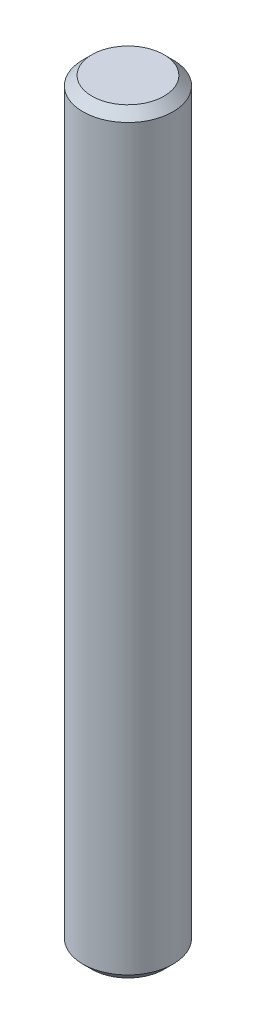
ISO-10303-21;
HEADER;
FILE_DESCRIPTION(('STEP AP214'),'2;1');
FILE_NAME('part.step','',(''),(''),'','','');
FILE_SCHEMA(('AUTOMOTIVE_DESIGN { 1 0 10303 214 1 1 1 1 }'));
ENDSEC;
DATA;
#1=APPLICATION_CONTEXT('core data for automotive mechanical design processes');
#2=APPLICATION_PROTOCOL_DEFINITION('international standard','automotive_design',2000,#1);
#3=PRODUCT_CONTEXT('',#1,'mechanical');
#4=PRODUCT('Part','Part','',(#3));
#5=PRODUCT_RELATED_PRODUCT_CATEGORY('part','',(#4));
#6=PRODUCT_DEFINITION_FORMATION('','',#4);
#7=PRODUCT_DEFINITION_CONTEXT('part definition',#1,'design');
#8=PRODUCT_DEFINITION('design','',#6,#7);
#9=PRODUCT_DEFINITION_SHAPE('','',#8);
#10=(LENGTH_UNIT() NAMED_UNIT(*) SI_UNIT(.MILLI.,.METRE.));
#11=(NAMED_UNIT(*) PLANE_ANGLE_UNIT() SI_UNIT($,.RADIAN.));
#12=(NAMED_UNIT(*) SI_UNIT($,.STERADIAN.) SOLID_ANGLE_UNIT());
#13=UNCERTAINTY_MEASURE_WITH_UNIT(LENGTH_MEASURE(1.E-05),#10,'distance_accuracy_value','');
#14=(GEOMETRIC_REPRESENTATION_CONTEXT(3) GLOBAL_UNCERTAINTY_ASSIGNED_CONTEXT((#13)) GLOBAL_UNIT_ASSIGNED_CONTEXT((#10,
#11,#12)) REPRESENTATION_CONTEXT('',''));
#15=CARTESIAN_POINT('',(0.,0.,0.));
#16=DIRECTION('',(0.,0.,1.));
#17=DIRECTION('',(1.,0.,0.));
#18=AXIS2_PLACEMENT_3D('',#15,#16,#17);
#19=CARTESIAN_POINT('',(0.,53.34,0.));
#20=DIRECTION('',(0.,-1.,0.));
#21=DIRECTION('',(0.,0.,-1.));
#22=AXIS2_PLACEMENT_3D('',#19,#20,#21);
#23=CYLINDRICAL_SURFACE('',#22,3.175);
#24=CARTESIAN_POINT('',(0.,0.635000000000004,0.));
#25=DIRECTION('',(0.,1.,0.));
#26=DIRECTION('',(0.,0.,1.));
#27=AXIS2_PLACEMENT_3D('',#24,#25,#26);
#28=CIRCLE('',#27,3.175);
#29=CARTESIAN_POINT('',(0.,0.635000000000004,3.175));
#30=VERTEX_POINT('',#29);
#31=EDGE_CURVE('E59',#30,#30,#28,.T.);
#32=ORIENTED_EDGE('',*,*,#31,.T.);
#33=EDGE_LOOP('',(#32));
#34=FACE_BOUND('',#33,.T.);
#35=CARTESIAN_POINT('',(0.,52.705,0.));
#36=DIRECTION('',(0.,1.,0.));
#37=DIRECTION('',(0.,0.,1.));
#38=AXIS2_PLACEMENT_3D('',#35,#36,#37);
#39=CIRCLE('',#38,3.175);
#40=CARTESIAN_POINT('',(0.,52.705,3.175));
#41=VERTEX_POINT('',#40);
#42=EDGE_CURVE('E64',#41,#41,#39,.F.);
#43=ORIENTED_EDGE('',*,*,#42,.T.);
#44=EDGE_LOOP('',(#43));
#45=FACE_BOUND('',#44,.T.);
#46=ADVANCED_FACE('F45',(#34,#45),#23,.T.);
#47=CARTESIAN_POINT('',(0.,53.34,0.));
#48=DIRECTION('',(0.,1.,0.));
#49=DIRECTION('',(0.,0.,1.));
#50=AXIS2_PLACEMENT_3D('',#47,#48,#49);
#51=PLANE('',#50);
#52=CARTESIAN_POINT('',(0.,53.34,0.));
#53=DIRECTION('',(0.,1.,0.));
#54=DIRECTION('',(0.,0.,1.));
#55=AXIS2_PLACEMENT_3D('',#52,#53,#54);
#56=CIRCLE('',#55,2.53999999999999);
#57=CARTESIAN_POINT('',(0.,53.34,2.53999999999999));
#58=VERTEX_POINT('',#57);
#59=EDGE_CURVE('E10',#58,#58,#56,.T.);
#60=ORIENTED_EDGE('',*,*,#59,.T.);
#61=EDGE_LOOP('',(#60));
#62=FACE_BOUND('',#61,.T.);
#63=ADVANCED_FACE('F81',(#62),#51,.T.);
#64=CARTESIAN_POINT('',(0.,0.,0.));
#65=DIRECTION('',(0.,1.,0.));
#66=DIRECTION('',(0.,0.,1.));
#67=AXIS2_PLACEMENT_3D('',#64,#65,#66);
#68=PLANE('',#67);
#69=CARTESIAN_POINT('',(0.,0.,0.));
#70=DIRECTION('',(0.,1.,0.));
#71=DIRECTION('',(0.,0.,1.));
#72=AXIS2_PLACEMENT_3D('',#69,#70,#71);
#73=CIRCLE('',#72,2.54);
#74=CARTESIAN_POINT('',(0.,0.,2.54));
#75=VERTEX_POINT('',#74);
#76=EDGE_CURVE('E54',#75,#75,#73,.F.);
#77=ORIENTED_EDGE('',*,*,#76,.T.);
#78=EDGE_LOOP('',(#77));
#79=FACE_BOUND('',#78,.T.);
#80=ADVANCED_FACE('F78',(#79),#68,.F.);
#81=CARTESIAN_POINT('',(0.,0.635000000000004,0.));
#82=DIRECTION('',(0.,1.,0.));
#83=DIRECTION('',(0.,0.,1.));
#84=AXIS2_PLACEMENT_3D('',#81,#82,#83);
#85=CONICAL_SURFACE('',#84,3.175,0.785398163397445);
#86=ORIENTED_EDGE('',*,*,#76,.F.);
#87=EDGE_LOOP('',(#86));
#88=FACE_BOUND('',#87,.T.);
#89=ORIENTED_EDGE('',*,*,#31,.F.);
#90=EDGE_LOOP('',(#89));
#91=FACE_BOUND('',#90,.T.);
#92=ADVANCED_FACE('F74',(#88,#91),#85,.T.);
#93=CARTESIAN_POINT('',(0.,53.34,0.));
#94=DIRECTION('',(0.,-1.,0.));
#95=DIRECTION('',(0.,0.,-1.));
#96=AXIS2_PLACEMENT_3D('',#93,#94,#95);
#97=CONICAL_SURFACE('',#96,2.53999999999999,0.78539816339745);
#98=ORIENTED_EDGE('',*,*,#42,.F.);
#99=EDGE_LOOP('',(#98));
#100=FACE_BOUND('',#99,.T.);
#101=ORIENTED_EDGE('',*,*,#59,.F.);
#102=EDGE_LOOP('',(#101));
#103=FACE_BOUND('',#102,.T.);
#104=ADVANCED_FACE('F48',(#100,#103),#97,.T.);
#105=CLOSED_SHELL('',(#46,#63,#80,#92,#104));
#106=MANIFOLD_SOLID_BREP('B2',#105);
#107=ADVANCED_BREP_SHAPE_REPRESENTATION('',(#18,#106),#14);
#108=SHAPE_DEFINITION_REPRESENTATION(#9,#107);
ENDSEC;
END-ISO-10303-21;
